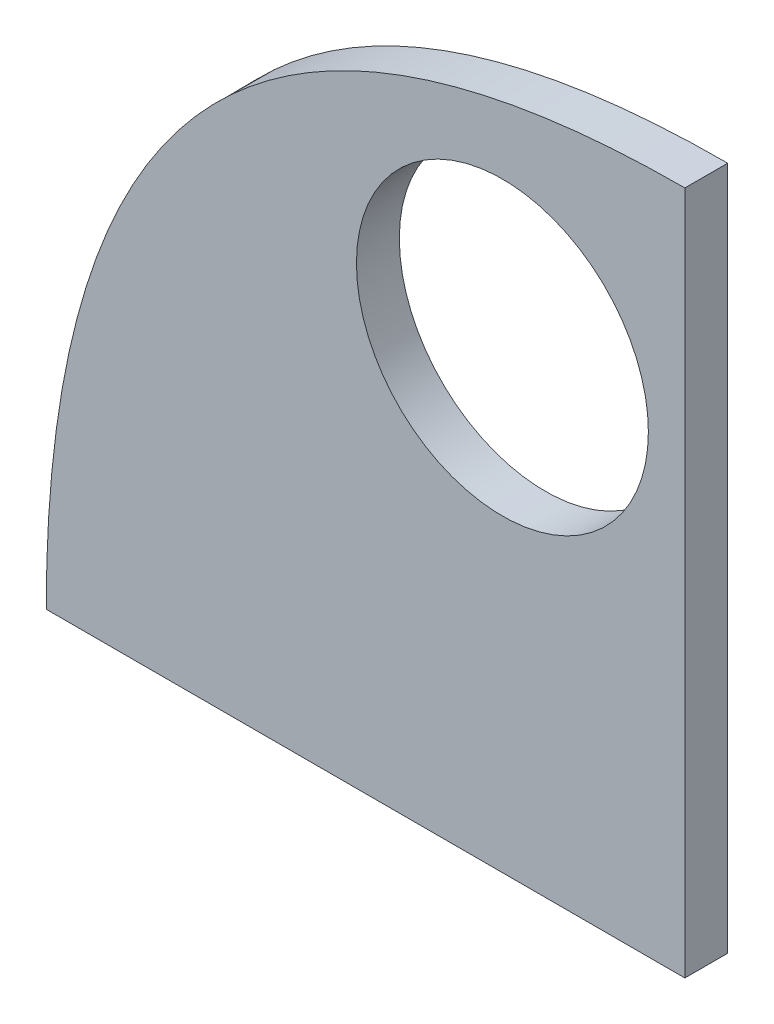
ISO-10303-21;
HEADER;
FILE_DESCRIPTION(('STEP AP214'),'2;1');
FILE_NAME('part.step','',(''),(''),'','','');
FILE_SCHEMA(('AUTOMOTIVE_DESIGN { 1 0 10303 214 1 1 1 1 }'));
ENDSEC;
DATA;
#1=APPLICATION_CONTEXT('core data for automotive mechanical design processes');
#2=APPLICATION_PROTOCOL_DEFINITION('international standard','automotive_design',2000,#1);
#3=PRODUCT_CONTEXT('',#1,'mechanical');
#4=PRODUCT('Part','Part','',(#3));
#5=PRODUCT_RELATED_PRODUCT_CATEGORY('part','',(#4));
#6=PRODUCT_DEFINITION_FORMATION('','',#4);
#7=PRODUCT_DEFINITION_CONTEXT('part definition',#1,'design');
#8=PRODUCT_DEFINITION('design','',#6,#7);
#9=PRODUCT_DEFINITION_SHAPE('','',#8);
#10=(LENGTH_UNIT() NAMED_UNIT(*) SI_UNIT(.MILLI.,.METRE.));
#11=(NAMED_UNIT(*) PLANE_ANGLE_UNIT() SI_UNIT($,.RADIAN.));
#12=(NAMED_UNIT(*) SI_UNIT($,.STERADIAN.) SOLID_ANGLE_UNIT());
#13=UNCERTAINTY_MEASURE_WITH_UNIT(LENGTH_MEASURE(1.E-05),#10,'distance_accuracy_value','');
#14=(GEOMETRIC_REPRESENTATION_CONTEXT(3) GLOBAL_UNCERTAINTY_ASSIGNED_CONTEXT((#13)) GLOBAL_UNIT_ASSIGNED_CONTEXT((#10,
#11,#12)) REPRESENTATION_CONTEXT('',''));
#15=CARTESIAN_POINT('',(0.,0.,0.));
#16=DIRECTION('',(0.,0.,1.));
#17=DIRECTION('',(1.,0.,0.));
#18=AXIS2_PLACEMENT_3D('',#15,#16,#17);
#19=CARTESIAN_POINT('',(0.,0.,0.));
#20=DIRECTION('',(0.,0.,1.));
#21=DIRECTION('',(1.,0.,0.));
#22=AXIS2_PLACEMENT_3D('',#19,#20,#21);
#23=PLANE('',#22);
#24=DIRECTION('',(0.,1.,0.));
#25=VECTOR('',#24,1.);
#26=CARTESIAN_POINT('',(0.,0.,0.));
#27=LINE('',#26,#25);
#28=CARTESIAN_POINT('',(0.,0.,0.));
#29=VERTEX_POINT('',#28);
#30=CARTESIAN_POINT('',(0.,75.,0.));
#31=VERTEX_POINT('',#30);
#32=EDGE_CURVE('E154',#29,#31,#27,.T.);
#33=ORIENTED_EDGE('',*,*,#32,.F.);
#34=DIRECTION('',(-1.,0.,0.));
#35=VECTOR('',#34,1.);
#36=CARTESIAN_POINT('',(0.,0.,0.));
#37=LINE('',#36,#35);
#38=CARTESIAN_POINT('',(-70.,0.,0.));
#39=VERTEX_POINT('',#38);
#40=EDGE_CURVE('E164',#29,#39,#37,.T.);
#41=ORIENTED_EDGE('',*,*,#40,.T.);
#42=CARTESIAN_POINT('',(0.,75.,0.));
#43=CARTESIAN_POINT('',(-70.,75.,0.));
#44=CARTESIAN_POINT('',(-70.,0.,0.));
#45=B_SPLINE_CURVE_WITH_KNOTS('',2,(#42,#43,#44),.UNSPECIFIED.,.F.,.F.,(3,3),(0.,1.),.UNSPECIFIED.);
#46=EDGE_CURVE('E188',#31,#39,#45,.T.);
#47=ORIENTED_EDGE('',*,*,#46,.F.);
#48=EDGE_LOOP('',(#33,#41,#47));
#49=FACE_BOUND('',#48,.T.);
#50=CARTESIAN_POINT('',(-20.,49.85,0.));
#51=DIRECTION('',(0.,0.,1.));
#52=DIRECTION('',(1.,0.,0.));
#53=AXIS2_PLACEMENT_3D('',#50,#51,#52);
#54=CIRCLE('',#53,16.);
#55=CARTESIAN_POINT('',(-4.,49.85,0.));
#56=VERTEX_POINT('',#55);
#57=EDGE_CURVE('E150',#56,#56,#54,.T.);
#58=ORIENTED_EDGE('',*,*,#57,.T.);
#59=EDGE_LOOP('',(#58));
#60=FACE_BOUND('',#59,.T.);
#61=DIRECTION('',(1.,0.,0.));
#62=VECTOR('',#61,1.);
#63=CARTESIAN_POINT('',(0.,7.,0.));
#64=LINE('',#63,#62);
#65=CARTESIAN_POINT('',(-36.1,7.,0.));
#66=VERTEX_POINT('',#65);
#67=CARTESIAN_POINT('',(-21.802775637732,7.,0.));
#68=VERTEX_POINT('',#67);
#69=EDGE_CURVE('E53',#66,#68,#64,.T.);
#70=ORIENTED_EDGE('',*,*,#69,.T.);
#71=CARTESIAN_POINT('',(-20.,9.99999999999999,0.));
#72=DIRECTION('',(0.,0.,1.));
#73=DIRECTION('',(1.,0.,0.));
#74=AXIS2_PLACEMENT_3D('',#71,#72,#73);
#75=CIRCLE('',#74,3.5);
#76=CARTESIAN_POINT('',(-18.197224362268,7.,0.));
#77=VERTEX_POINT('',#76);
#78=EDGE_CURVE('E149',#68,#77,#75,.T.);
#79=ORIENTED_EDGE('',*,*,#78,.T.);
#80=DIRECTION('',(1.,0.,0.));
#81=VECTOR('',#80,1.);
#82=CARTESIAN_POINT('',(0.,7.,0.));
#83=LINE('',#82,#81);
#84=CARTESIAN_POINT('',(-3.90000000000001,7.,0.));
#85=VERTEX_POINT('',#84);
#86=EDGE_CURVE('E208',#77,#85,#83,.T.);
#87=ORIENTED_EDGE('',*,*,#86,.T.);
#88=DIRECTION('',(0.,1.,0.));
#89=VECTOR('',#88,1.);
#90=CARTESIAN_POINT('',(-3.90000000000001,0.,0.));
#91=LINE('',#90,#89);
#92=CARTESIAN_POINT('',(-3.90000000000001,13.,0.));
#93=VERTEX_POINT('',#92);
#94=EDGE_CURVE('E215',#85,#93,#91,.T.);
#95=ORIENTED_EDGE('',*,*,#94,.T.);
#96=DIRECTION('',(1.,0.,0.));
#97=VECTOR('',#96,1.);
#98=CARTESIAN_POINT('',(0.,13.,0.));
#99=LINE('',#98,#97);
#100=CARTESIAN_POINT('',(-18.197224362268,13.,0.));
#101=VERTEX_POINT('',#100);
#102=EDGE_CURVE('E218',#101,#93,#99,.T.);
#103=ORIENTED_EDGE('',*,*,#102,.F.);
#104=CARTESIAN_POINT('',(-20.,9.99999999999999,0.));
#105=DIRECTION('',(0.,0.,1.));
#106=DIRECTION('',(1.,0.,0.));
#107=AXIS2_PLACEMENT_3D('',#104,#105,#106);
#108=CIRCLE('',#107,3.5);
#109=CARTESIAN_POINT('',(-21.802775637732,13.,0.));
#110=VERTEX_POINT('',#109);
#111=EDGE_CURVE('E221',#101,#110,#108,.T.);
#112=ORIENTED_EDGE('',*,*,#111,.T.);
#113=DIRECTION('',(1.,0.,0.));
#114=VECTOR('',#113,1.);
#115=CARTESIAN_POINT('',(0.,13.,0.));
#116=LINE('',#115,#114);
#117=CARTESIAN_POINT('',(-36.1,13.,0.));
#118=VERTEX_POINT('',#117);
#119=EDGE_CURVE('E224',#118,#110,#116,.T.);
#120=ORIENTED_EDGE('',*,*,#119,.F.);
#121=DIRECTION('',(0.,1.,0.));
#122=VECTOR('',#121,1.);
#123=CARTESIAN_POINT('',(-36.1,0.,0.));
#124=LINE('',#123,#122);
#125=EDGE_CURVE('E145',#66,#118,#124,.T.);
#126=ORIENTED_EDGE('',*,*,#125,.F.);
#127=EDGE_LOOP('',(#70,#79,#87,#95,#103,#112,#120,#126));
#128=FACE_BOUND('',#127,.T.);
#129=ADVANCED_FACE('F38',(#49,#60,#128),#23,.F.);
#130=CARTESIAN_POINT('',(0.,0.,4.7));
#131=DIRECTION('',(-1.,0.,0.));
#132=DIRECTION('',(0.,0.,1.));
#133=AXIS2_PLACEMENT_3D('',#130,#131,#132);
#134=PLANE('',#133);
#135=ORIENTED_EDGE('',*,*,#32,.T.);
#136=DIRECTION('',(0.,0.,-1.));
#137=VECTOR('',#136,1.);
#138=CARTESIAN_POINT('',(0.,75.,4.7));
#139=LINE('',#138,#137);
#140=CARTESIAN_POINT('',(0.,75.,4.7));
#141=VERTEX_POINT('',#140);
#142=EDGE_CURVE('E11',#141,#31,#139,.T.);
#143=ORIENTED_EDGE('',*,*,#142,.F.);
#144=DIRECTION('',(0.,1.,0.));
#145=VECTOR('',#144,1.);
#146=CARTESIAN_POINT('',(0.,0.,4.7));
#147=LINE('',#146,#145);
#148=CARTESIAN_POINT('',(0.,0.,4.7));
#149=VERTEX_POINT('',#148);
#150=EDGE_CURVE('E163',#149,#141,#147,.T.);
#151=ORIENTED_EDGE('',*,*,#150,.F.);
#152=DIRECTION('',(0.,0.,-1.));
#153=VECTOR('',#152,1.);
#154=CARTESIAN_POINT('',(0.,0.,4.7));
#155=LINE('',#154,#153);
#156=EDGE_CURVE('E62',#149,#29,#155,.T.);
#157=ORIENTED_EDGE('',*,*,#156,.T.);
#158=EDGE_LOOP('',(#135,#143,#151,#157));
#159=FACE_BOUND('',#158,.T.);
#160=ADVANCED_FACE('F178',(#159),#134,.F.);
#161=CARTESIAN_POINT('',(0.,75.,4.7));
#162=CARTESIAN_POINT('',(-70.,75.,4.7));
#163=CARTESIAN_POINT('',(-70.,0.,4.7));
#164=B_SPLINE_CURVE_WITH_KNOTS('',2,(#161,#162,#163),.UNSPECIFIED.,.F.,.F.,(3,3),(0.,1.),.UNSPECIFIED.);
#165=DIRECTION('',(0.,0.,-1.));
#166=VECTOR('',#165,1.);
#167=SURFACE_OF_LINEAR_EXTRUSION('',#164,#166);
#168=ORIENTED_EDGE('',*,*,#46,.T.);
#169=DIRECTION('',(0.,0.,-1.));
#170=VECTOR('',#169,1.);
#171=CARTESIAN_POINT('',(-70.,0.,4.7));
#172=LINE('',#171,#170);
#173=CARTESIAN_POINT('',(-70.,0.,4.7));
#174=VERTEX_POINT('',#173);
#175=EDGE_CURVE('E46',#174,#39,#172,.T.);
#176=ORIENTED_EDGE('',*,*,#175,.F.);
#177=EDGE_CURVE('E82',#141,#174,#164,.T.);
#178=ORIENTED_EDGE('',*,*,#177,.F.);
#179=ORIENTED_EDGE('',*,*,#142,.T.);
#180=EDGE_LOOP('',(#168,#176,#178,#179));
#181=FACE_BOUND('',#180,.T.);
#182=ADVANCED_FACE('F175',(#181),#167,.F.);
#183=CARTESIAN_POINT('',(-20.,49.85,4.7));
#184=DIRECTION('',(0.,0.,-1.));
#185=DIRECTION('',(-1.,0.,0.));
#186=AXIS2_PLACEMENT_3D('',#183,#184,#185);
#187=CYLINDRICAL_SURFACE('',#186,16.);
#188=CARTESIAN_POINT('',(-20.,49.85,4.7));
#189=DIRECTION('',(0.,0.,1.));
#190=DIRECTION('',(1.,0.,0.));
#191=AXIS2_PLACEMENT_3D('',#188,#189,#190);
#192=CIRCLE('',#191,16.);
#193=CARTESIAN_POINT('',(-4.,49.85,4.7));
#194=VERTEX_POINT('',#193);
#195=EDGE_CURVE('E160',#194,#194,#192,.T.);
#196=ORIENTED_EDGE('',*,*,#195,.T.);
#197=EDGE_LOOP('',(#196));
#198=FACE_BOUND('',#197,.T.);
#199=ORIENTED_EDGE('',*,*,#57,.F.);
#200=EDGE_LOOP('',(#199));
#201=FACE_BOUND('',#200,.T.);
#202=ADVANCED_FACE('F40',(#198,#201),#187,.F.);
#203=CARTESIAN_POINT('',(0.,0.,4.7));
#204=DIRECTION('',(0.,-1.,0.));
#205=DIRECTION('',(1.,0.,0.));
#206=AXIS2_PLACEMENT_3D('',#203,#204,#205);
#207=PLANE('',#206);
#208=ORIENTED_EDGE('',*,*,#40,.F.);
#209=ORIENTED_EDGE('',*,*,#156,.F.);
#210=DIRECTION('',(-1.,0.,0.));
#211=VECTOR('',#210,1.);
#212=CARTESIAN_POINT('',(0.,0.,4.7));
#213=LINE('',#212,#211);
#214=EDGE_CURVE('E170',#149,#174,#213,.T.);
#215=ORIENTED_EDGE('',*,*,#214,.T.);
#216=ORIENTED_EDGE('',*,*,#175,.T.);
#217=EDGE_LOOP('',(#208,#209,#215,#216));
#218=FACE_BOUND('',#217,.T.);
#219=ADVANCED_FACE('F179',(#218),#207,.T.);
#220=CARTESIAN_POINT('',(0.,0.,4.7));
#221=DIRECTION('',(0.,0.,1.));
#222=DIRECTION('',(1.,0.,0.));
#223=AXIS2_PLACEMENT_3D('',#220,#221,#222);
#224=PLANE('',#223);
#225=ORIENTED_EDGE('',*,*,#195,.F.);
#226=EDGE_LOOP('',(#225));
#227=FACE_BOUND('',#226,.T.);
#228=ORIENTED_EDGE('',*,*,#150,.T.);
#229=ORIENTED_EDGE('',*,*,#177,.T.);
#230=ORIENTED_EDGE('',*,*,#214,.F.);
#231=EDGE_LOOP('',(#228,#229,#230));
#232=FACE_BOUND('',#231,.T.);
#233=ADVANCED_FACE('F289',(#227,#232),#224,.T.);
#234=CARTESIAN_POINT('',(0.,7.,1.7));
#235=DIRECTION('',(0.,1.,0.));
#236=DIRECTION('',(0.,0.,1.));
#237=AXIS2_PLACEMENT_3D('',#234,#235,#236);
#238=PLANE('',#237);
#239=ORIENTED_EDGE('',*,*,#69,.F.);
#240=DIRECTION('',(0.,0.,-1.));
#241=VECTOR('',#240,1.);
#242=CARTESIAN_POINT('',(-36.1,7.,1.7));
#243=LINE('',#242,#241);
#244=CARTESIAN_POINT('',(-36.1,7.,1.7));
#245=VERTEX_POINT('',#244);
#246=EDGE_CURVE('E144',#245,#66,#243,.T.);
#247=ORIENTED_EDGE('',*,*,#246,.F.);
#248=DIRECTION('',(1.,0.,0.));
#249=VECTOR('',#248,1.);
#250=CARTESIAN_POINT('',(0.,7.,1.7));
#251=LINE('',#250,#249);
#252=CARTESIAN_POINT('',(-21.802775637732,7.,1.7));
#253=VERTEX_POINT('',#252);
#254=EDGE_CURVE('E134',#245,#253,#251,.T.);
#255=ORIENTED_EDGE('',*,*,#254,.T.);
#256=DIRECTION('',(0.,0.,-1.));
#257=VECTOR('',#256,1.);
#258=CARTESIAN_POINT('',(-21.802775637732,7.,1.7));
#259=LINE('',#258,#257);
#260=EDGE_CURVE('E143',#253,#68,#259,.T.);
#261=ORIENTED_EDGE('',*,*,#260,.T.);
#262=EDGE_LOOP('',(#239,#247,#255,#261));
#263=FACE_BOUND('',#262,.T.);
#264=ADVANCED_FACE('F142',(#263),#238,.T.);
#265=CARTESIAN_POINT('',(-20.,9.99999999999999,1.7));
#266=DIRECTION('',(0.,0.,-1.));
#267=DIRECTION('',(-1.,0.,0.));
#268=AXIS2_PLACEMENT_3D('',#265,#266,#267);
#269=CYLINDRICAL_SURFACE('',#268,3.5);
#270=ORIENTED_EDGE('',*,*,#78,.F.);
#271=ORIENTED_EDGE('',*,*,#260,.F.);
#272=CARTESIAN_POINT('',(-20.,9.99999999999999,1.7));
#273=DIRECTION('',(0.,0.,1.));
#274=DIRECTION('',(1.,0.,0.));
#275=AXIS2_PLACEMENT_3D('',#272,#273,#274);
#276=CIRCLE('',#275,3.5);
#277=CARTESIAN_POINT('',(-18.197224362268,7.,1.7));
#278=VERTEX_POINT('',#277);
#279=EDGE_CURVE('E130',#253,#278,#276,.T.);
#280=ORIENTED_EDGE('',*,*,#279,.T.);
#281=DIRECTION('',(0.,0.,-1.));
#282=VECTOR('',#281,1.);
#283=CARTESIAN_POINT('',(-18.197224362268,7.,1.7));
#284=LINE('',#283,#282);
#285=EDGE_CURVE('E151',#278,#77,#284,.T.);
#286=ORIENTED_EDGE('',*,*,#285,.T.);
#287=EDGE_LOOP('',(#270,#271,#280,#286));
#288=FACE_BOUND('',#287,.T.);
#289=ADVANCED_FACE('F147',(#288),#269,.F.);
#290=CARTESIAN_POINT('',(0.,7.,1.7));
#291=DIRECTION('',(0.,1.,0.));
#292=DIRECTION('',(-1.,0.,0.));
#293=AXIS2_PLACEMENT_3D('',#290,#291,#292);
#294=PLANE('',#293);
#295=ORIENTED_EDGE('',*,*,#86,.F.);
#296=ORIENTED_EDGE('',*,*,#285,.F.);
#297=DIRECTION('',(1.,0.,0.));
#298=VECTOR('',#297,1.);
#299=CARTESIAN_POINT('',(0.,7.,1.7));
#300=LINE('',#299,#298);
#301=CARTESIAN_POINT('',(-3.90000000000001,7.,1.7));
#302=VERTEX_POINT('',#301);
#303=EDGE_CURVE('E137',#278,#302,#300,.T.);
#304=ORIENTED_EDGE('',*,*,#303,.T.);
#305=DIRECTION('',(0.,0.,-1.));
#306=VECTOR('',#305,1.);
#307=CARTESIAN_POINT('',(-3.90000000000001,7.,1.7));
#308=LINE('',#307,#306);
#309=EDGE_CURVE('E156',#302,#85,#308,.T.);
#310=ORIENTED_EDGE('',*,*,#309,.T.);
#311=EDGE_LOOP('',(#295,#296,#304,#310));
#312=FACE_BOUND('',#311,.T.);
#313=ADVANCED_FACE('F240',(#312),#294,.T.);
#314=CARTESIAN_POINT('',(-3.90000000000001,0.,1.7));
#315=DIRECTION('',(-1.,0.,0.));
#316=DIRECTION('',(0.,-1.,0.));
#317=AXIS2_PLACEMENT_3D('',#314,#315,#316);
#318=PLANE('',#317);
#319=ORIENTED_EDGE('',*,*,#94,.F.);
#320=ORIENTED_EDGE('',*,*,#309,.F.);
#321=DIRECTION('',(0.,1.,0.));
#322=VECTOR('',#321,1.);
#323=CARTESIAN_POINT('',(-3.90000000000001,0.,1.7));
#324=LINE('',#323,#322);
#325=CARTESIAN_POINT('',(-3.90000000000001,13.,1.7));
#326=VERTEX_POINT('',#325);
#327=EDGE_CURVE('E266',#302,#326,#324,.T.);
#328=ORIENTED_EDGE('',*,*,#327,.T.);
#329=DIRECTION('',(0.,0.,-1.));
#330=VECTOR('',#329,1.);
#331=CARTESIAN_POINT('',(-3.90000000000001,13.,1.7));
#332=LINE('',#331,#330);
#333=EDGE_CURVE('E235',#326,#93,#332,.T.);
#334=ORIENTED_EDGE('',*,*,#333,.T.);
#335=EDGE_LOOP('',(#319,#320,#328,#334));
#336=FACE_BOUND('',#335,.T.);
#337=ADVANCED_FACE('F242',(#336),#318,.T.);
#338=CARTESIAN_POINT('',(0.,13.,1.7));
#339=DIRECTION('',(0.,1.,0.));
#340=DIRECTION('',(-1.,0.,0.));
#341=AXIS2_PLACEMENT_3D('',#338,#339,#340);
#342=PLANE('',#341);
#343=ORIENTED_EDGE('',*,*,#102,.T.);
#344=ORIENTED_EDGE('',*,*,#333,.F.);
#345=DIRECTION('',(1.,0.,0.));
#346=VECTOR('',#345,1.);
#347=CARTESIAN_POINT('',(0.,13.,1.7));
#348=LINE('',#347,#346);
#349=CARTESIAN_POINT('',(-18.197224362268,13.,1.7));
#350=VERTEX_POINT('',#349);
#351=EDGE_CURVE('E250',#350,#326,#348,.T.);
#352=ORIENTED_EDGE('',*,*,#351,.F.);
#353=DIRECTION('',(0.,0.,-1.));
#354=VECTOR('',#353,1.);
#355=CARTESIAN_POINT('',(-18.197224362268,13.,1.7));
#356=LINE('',#355,#354);
#357=EDGE_CURVE('E233',#350,#101,#356,.T.);
#358=ORIENTED_EDGE('',*,*,#357,.T.);
#359=EDGE_LOOP('',(#343,#344,#352,#358));
#360=FACE_BOUND('',#359,.T.);
#361=ADVANCED_FACE('F247',(#360),#342,.F.);
#362=CARTESIAN_POINT('',(-20.,9.99999999999999,1.7));
#363=DIRECTION('',(0.,0.,-1.));
#364=DIRECTION('',(-1.,0.,0.));
#365=AXIS2_PLACEMENT_3D('',#362,#363,#364);
#366=CYLINDRICAL_SURFACE('',#365,3.5);
#367=ORIENTED_EDGE('',*,*,#111,.F.);
#368=ORIENTED_EDGE('',*,*,#357,.F.);
#369=CARTESIAN_POINT('',(-20.,9.99999999999999,1.7));
#370=DIRECTION('',(0.,0.,1.));
#371=DIRECTION('',(1.,0.,0.));
#372=AXIS2_PLACEMENT_3D('',#369,#370,#371);
#373=CIRCLE('',#372,3.5);
#374=CARTESIAN_POINT('',(-21.802775637732,13.,1.7));
#375=VERTEX_POINT('',#374);
#376=EDGE_CURVE('E255',#350,#375,#373,.T.);
#377=ORIENTED_EDGE('',*,*,#376,.T.);
#378=DIRECTION('',(0.,0.,-1.));
#379=VECTOR('',#378,1.);
#380=CARTESIAN_POINT('',(-21.802775637732,13.,1.7));
#381=LINE('',#380,#379);
#382=EDGE_CURVE('E231',#375,#110,#381,.T.);
#383=ORIENTED_EDGE('',*,*,#382,.T.);
#384=EDGE_LOOP('',(#367,#368,#377,#383));
#385=FACE_BOUND('',#384,.T.);
#386=ADVANCED_FACE('F253',(#385),#366,.F.);
#387=CARTESIAN_POINT('',(0.,13.,1.7));
#388=DIRECTION('',(0.,1.,0.));
#389=DIRECTION('',(-1.,0.,0.));
#390=AXIS2_PLACEMENT_3D('',#387,#388,#389);
#391=PLANE('',#390);
#392=ORIENTED_EDGE('',*,*,#119,.T.);
#393=ORIENTED_EDGE('',*,*,#382,.F.);
#394=DIRECTION('',(1.,0.,0.));
#395=VECTOR('',#394,1.);
#396=CARTESIAN_POINT('',(0.,13.,1.7));
#397=LINE('',#396,#395);
#398=CARTESIAN_POINT('',(-36.1,13.,1.7));
#399=VERTEX_POINT('',#398);
#400=EDGE_CURVE('E260',#399,#375,#397,.T.);
#401=ORIENTED_EDGE('',*,*,#400,.F.);
#402=DIRECTION('',(0.,0.,-1.));
#403=VECTOR('',#402,1.);
#404=CARTESIAN_POINT('',(-36.1,13.,1.7));
#405=LINE('',#404,#403);
#406=EDGE_CURVE('E229',#399,#118,#405,.T.);
#407=ORIENTED_EDGE('',*,*,#406,.T.);
#408=EDGE_LOOP('',(#392,#393,#401,#407));
#409=FACE_BOUND('',#408,.T.);
#410=ADVANCED_FACE('F259',(#409),#391,.F.);
#411=CARTESIAN_POINT('',(-36.1,0.,1.7));
#412=DIRECTION('',(-1.,0.,0.));
#413=DIRECTION('',(0.,0.,1.));
#414=AXIS2_PLACEMENT_3D('',#411,#412,#413);
#415=PLANE('',#414);
#416=ORIENTED_EDGE('',*,*,#125,.T.);
#417=ORIENTED_EDGE('',*,*,#406,.F.);
#418=DIRECTION('',(0.,1.,0.));
#419=VECTOR('',#418,1.);
#420=CARTESIAN_POINT('',(-36.1,0.,1.7));
#421=LINE('',#420,#419);
#422=EDGE_CURVE('E211',#245,#399,#421,.T.);
#423=ORIENTED_EDGE('',*,*,#422,.F.);
#424=ORIENTED_EDGE('',*,*,#246,.T.);
#425=EDGE_LOOP('',(#416,#417,#423,#424));
#426=FACE_BOUND('',#425,.T.);
#427=ADVANCED_FACE('F262',(#426),#415,.F.);
#428=CARTESIAN_POINT('',(0.,0.,1.7));
#429=DIRECTION('',(0.,0.,1.));
#430=DIRECTION('',(1.,0.,0.));
#431=AXIS2_PLACEMENT_3D('',#428,#429,#430);
#432=PLANE('',#431);
#433=ORIENTED_EDGE('',*,*,#254,.F.);
#434=ORIENTED_EDGE('',*,*,#422,.T.);
#435=ORIENTED_EDGE('',*,*,#400,.T.);
#436=ORIENTED_EDGE('',*,*,#376,.F.);
#437=ORIENTED_EDGE('',*,*,#351,.T.);
#438=ORIENTED_EDGE('',*,*,#327,.F.);
#439=ORIENTED_EDGE('',*,*,#303,.F.);
#440=ORIENTED_EDGE('',*,*,#279,.F.);
#441=EDGE_LOOP('',(#433,#434,#435,#436,#437,#438,#439,#440));
#442=FACE_BOUND('',#441,.T.);
#443=ADVANCED_FACE('F132',(#442),#432,.F.);
#444=CLOSED_SHELL('',(#129,#160,#182,#202,#219,#233,#264,#289,#313,#337,#361,#386,#410,#427,#443));
#445=MANIFOLD_SOLID_BREP('B2',#444);
#446=ADVANCED_BREP_SHAPE_REPRESENTATION('',(#18,#445),#14);
#447=SHAPE_DEFINITION_REPRESENTATION(#9,#446);
ENDSEC;
END-ISO-10303-21;
